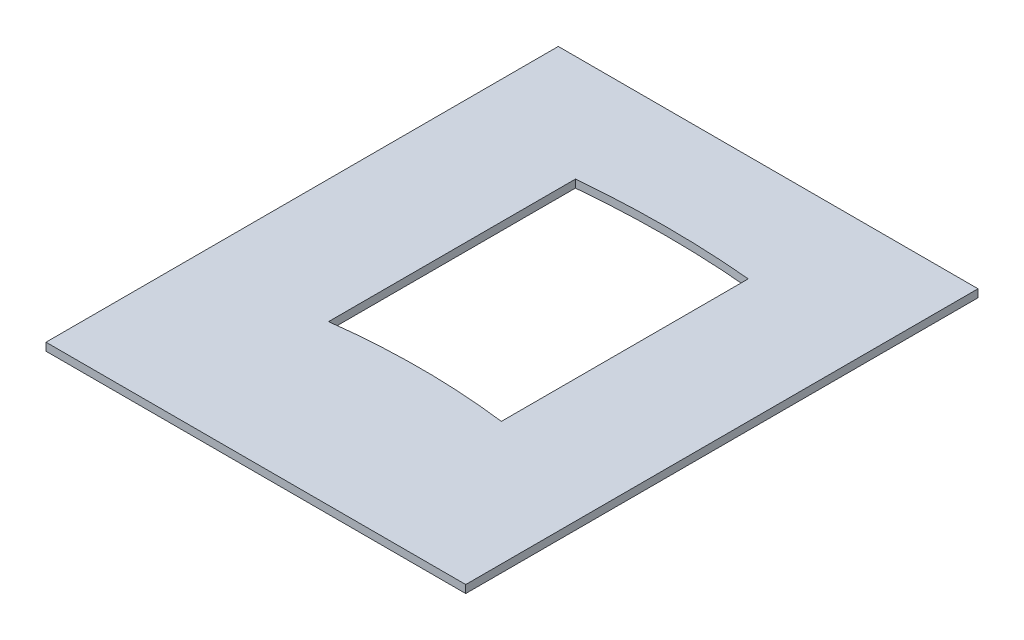
ISO-10303-21;
HEADER;
FILE_DESCRIPTION(('STEP AP214'),'2;1');
FILE_NAME('part.step','',(''),(''),'','','');
FILE_SCHEMA(('AUTOMOTIVE_DESIGN { 1 0 10303 214 1 1 1 1 }'));
ENDSEC;
DATA;
#1=APPLICATION_CONTEXT('core data for automotive mechanical design processes');
#2=APPLICATION_PROTOCOL_DEFINITION('international standard','automotive_design',2000,#1);
#3=PRODUCT_CONTEXT('',#1,'mechanical');
#4=PRODUCT('Part','Part','',(#3));
#5=PRODUCT_RELATED_PRODUCT_CATEGORY('part','',(#4));
#6=PRODUCT_DEFINITION_FORMATION('','',#4);
#7=PRODUCT_DEFINITION_CONTEXT('part definition',#1,'design');
#8=PRODUCT_DEFINITION('design','',#6,#7);
#9=PRODUCT_DEFINITION_SHAPE('','',#8);
#10=(LENGTH_UNIT() NAMED_UNIT(*) SI_UNIT(.MILLI.,.METRE.));
#11=(NAMED_UNIT(*) PLANE_ANGLE_UNIT() SI_UNIT($,.RADIAN.));
#12=(NAMED_UNIT(*) SI_UNIT($,.STERADIAN.) SOLID_ANGLE_UNIT());
#13=UNCERTAINTY_MEASURE_WITH_UNIT(LENGTH_MEASURE(1.E-05),#10,'distance_accuracy_value','');
#14=(GEOMETRIC_REPRESENTATION_CONTEXT(3) GLOBAL_UNCERTAINTY_ASSIGNED_CONTEXT((#13)) GLOBAL_UNIT_ASSIGNED_CONTEXT((#10,
#11,#12)) REPRESENTATION_CONTEXT('',''));
#15=CARTESIAN_POINT('',(0.,0.,0.));
#16=DIRECTION('',(0.,0.,1.));
#17=DIRECTION('',(1.,0.,0.));
#18=AXIS2_PLACEMENT_3D('',#15,#16,#17);
#19=CARTESIAN_POINT('',(0.,0.127,0.));
#20=DIRECTION('',(0.,-1.,0.));
#21=DIRECTION('',(0.,0.,-1.));
#22=AXIS2_PLACEMENT_3D('',#19,#20,#21);
#23=PLANE('',#22);
#24=DIRECTION('',(-1.,0.,0.));
#25=VECTOR('',#24,1.);
#26=CARTESIAN_POINT('',(-3.4,0.127,-5.72200648885004));
#27=LINE('',#26,#25);
#28=CARTESIAN_POINT('',(3.4,0.127,-5.72200648885004));
#29=VERTEX_POINT('',#28);
#30=CARTESIAN_POINT('',(-3.4,0.127,-5.72200648885004));
#31=VERTEX_POINT('',#30);
#32=EDGE_CURVE('E134',#29,#31,#27,.T.);
#33=ORIENTED_EDGE('',*,*,#32,.T.);
#34=DIRECTION('',(0.,0.,1.));
#35=VECTOR('',#34,1.);
#36=CARTESIAN_POINT('',(-3.4,0.127,-5.72200648885004));
#37=LINE('',#36,#35);
#38=CARTESIAN_POINT('',(-3.4,0.127,2.57747869518882));
#39=VERTEX_POINT('',#38);
#40=EDGE_CURVE('E137',#31,#39,#37,.T.);
#41=ORIENTED_EDGE('',*,*,#40,.T.);
#42=DIRECTION('',(1.,0.,0.));
#43=VECTOR('',#42,1.);
#44=CARTESIAN_POINT('',(-3.4,0.127,2.57747869518882));
#45=LINE('',#44,#43);
#46=CARTESIAN_POINT('',(3.4,0.127,2.57747869518882));
#47=VERTEX_POINT('',#46);
#48=EDGE_CURVE('E140',#39,#47,#45,.T.);
#49=ORIENTED_EDGE('',*,*,#48,.T.);
#50=DIRECTION('',(0.,0.,-1.));
#51=VECTOR('',#50,1.);
#52=CARTESIAN_POINT('',(3.4,0.127,-5.72200648885004));
#53=LINE('',#52,#51);
#54=EDGE_CURVE('E142',#47,#29,#53,.T.);
#55=ORIENTED_EDGE('',*,*,#54,.T.);
#56=EDGE_LOOP('',(#33,#41,#49,#55));
#57=FACE_BOUND('',#56,.T.);
#58=CARTESIAN_POINT('',(0.,0.127,10.9345237620756));
#59=DIRECTION('',(0.,1.,0.));
#60=DIRECTION('',(0.,0.,-1.));
#61=AXIS2_PLACEMENT_3D('',#58,#59,#60);
#62=CIRCLE('',#61,15.);
#63=CARTESIAN_POINT('',(1.4,0.127,-4.));
#64=VERTEX_POINT('',#63);
#65=CARTESIAN_POINT('',(-1.4,0.127,-4.));
#66=VERTEX_POINT('',#65);
#67=EDGE_CURVE('E98',#64,#66,#62,.T.);
#68=ORIENTED_EDGE('',*,*,#67,.F.);
#69=DIRECTION('',(0.,0.,-1.));
#70=VECTOR('',#69,1.);
#71=CARTESIAN_POINT('',(1.4,0.127,-4.));
#72=LINE('',#71,#70);
#73=CARTESIAN_POINT('',(1.4,0.127,0.));
#74=VERTEX_POINT('',#73);
#75=EDGE_CURVE('E120',#74,#64,#72,.T.);
#76=ORIENTED_EDGE('',*,*,#75,.F.);
#77=CARTESIAN_POINT('',(0.,0.127,10.9105453575887));
#78=DIRECTION('',(0.,-1.,0.));
#79=DIRECTION('',(0.,0.,-1.));
#80=AXIS2_PLACEMENT_3D('',#77,#78,#79);
#81=CIRCLE('',#80,11.);
#82=CARTESIAN_POINT('',(-1.40000000000001,0.127,0.));
#83=VERTEX_POINT('',#82);
#84=EDGE_CURVE('E118',#83,#74,#81,.T.);
#85=ORIENTED_EDGE('',*,*,#84,.F.);
#86=DIRECTION('',(0.,0.,1.));
#87=VECTOR('',#86,1.);
#88=CARTESIAN_POINT('',(-1.4,0.127,-4.));
#89=LINE('',#88,#87);
#90=EDGE_CURVE('E106',#66,#83,#89,.T.);
#91=ORIENTED_EDGE('',*,*,#90,.F.);
#92=EDGE_LOOP('',(#68,#76,#85,#91));
#93=FACE_BOUND('',#92,.T.);
#94=ADVANCED_FACE('F33',(#57,#93),#23,.F.);
#95=CARTESIAN_POINT('',(0.,0.,0.));
#96=DIRECTION('',(0.,-1.,0.));
#97=DIRECTION('',(0.,0.,-1.));
#98=AXIS2_PLACEMENT_3D('',#95,#96,#97);
#99=PLANE('',#98);
#100=DIRECTION('',(-1.,0.,0.));
#101=VECTOR('',#100,1.);
#102=CARTESIAN_POINT('',(-3.4,0.,-5.72200648885004));
#103=LINE('',#102,#101);
#104=CARTESIAN_POINT('',(3.4,0.,-5.72200648885004));
#105=VERTEX_POINT('',#104);
#106=CARTESIAN_POINT('',(-3.4,0.,-5.72200648885004));
#107=VERTEX_POINT('',#106);
#108=EDGE_CURVE('E114',#105,#107,#103,.T.);
#109=ORIENTED_EDGE('',*,*,#108,.F.);
#110=DIRECTION('',(0.,0.,-1.));
#111=VECTOR('',#110,1.);
#112=CARTESIAN_POINT('',(3.4,0.,-5.72200648885004));
#113=LINE('',#112,#111);
#114=CARTESIAN_POINT('',(3.4,0.,2.57747869518882));
#115=VERTEX_POINT('',#114);
#116=EDGE_CURVE('E138',#115,#105,#113,.T.);
#117=ORIENTED_EDGE('',*,*,#116,.F.);
#118=DIRECTION('',(1.,0.,0.));
#119=VECTOR('',#118,1.);
#120=CARTESIAN_POINT('',(-3.4,0.,2.57747869518882));
#121=LINE('',#120,#119);
#122=CARTESIAN_POINT('',(-3.4,0.,2.57747869518882));
#123=VERTEX_POINT('',#122);
#124=EDGE_CURVE('E149',#123,#115,#121,.T.);
#125=ORIENTED_EDGE('',*,*,#124,.F.);
#126=DIRECTION('',(0.,0.,1.));
#127=VECTOR('',#126,1.);
#128=CARTESIAN_POINT('',(-3.4,0.,-5.72200648885004));
#129=LINE('',#128,#127);
#130=EDGE_CURVE('E147',#107,#123,#129,.T.);
#131=ORIENTED_EDGE('',*,*,#130,.F.);
#132=EDGE_LOOP('',(#109,#117,#125,#131));
#133=FACE_BOUND('',#132,.T.);
#134=DIRECTION('',(0.,0.,-1.));
#135=VECTOR('',#134,1.);
#136=CARTESIAN_POINT('',(1.4,0.,-4.));
#137=LINE('',#136,#135);
#138=CARTESIAN_POINT('',(1.4,0.,0.));
#139=VERTEX_POINT('',#138);
#140=CARTESIAN_POINT('',(1.4,0.,-4.));
#141=VERTEX_POINT('',#140);
#142=EDGE_CURVE('E107',#139,#141,#137,.T.);
#143=ORIENTED_EDGE('',*,*,#142,.T.);
#144=CARTESIAN_POINT('',(0.,0.,10.9345237620756));
#145=DIRECTION('',(0.,1.,0.));
#146=DIRECTION('',(0.,0.,-1.));
#147=AXIS2_PLACEMENT_3D('',#144,#145,#146);
#148=CIRCLE('',#147,15.);
#149=CARTESIAN_POINT('',(-1.4,0.,-4.));
#150=VERTEX_POINT('',#149);
#151=EDGE_CURVE('E56',#141,#150,#148,.T.);
#152=ORIENTED_EDGE('',*,*,#151,.T.);
#153=DIRECTION('',(0.,0.,1.));
#154=VECTOR('',#153,1.);
#155=CARTESIAN_POINT('',(-1.4,0.,-4.));
#156=LINE('',#155,#154);
#157=CARTESIAN_POINT('',(-1.40000000000001,0.,0.));
#158=VERTEX_POINT('',#157);
#159=EDGE_CURVE('E113',#150,#158,#156,.T.);
#160=ORIENTED_EDGE('',*,*,#159,.T.);
#161=CARTESIAN_POINT('',(0.,0.,10.9105453575887));
#162=DIRECTION('',(0.,-1.,0.));
#163=DIRECTION('',(0.,0.,-1.));
#164=AXIS2_PLACEMENT_3D('',#161,#162,#163);
#165=CIRCLE('',#164,11.);
#166=EDGE_CURVE('E126',#158,#139,#165,.T.);
#167=ORIENTED_EDGE('',*,*,#166,.T.);
#168=EDGE_LOOP('',(#143,#152,#160,#167));
#169=FACE_BOUND('',#168,.T.);
#170=ADVANCED_FACE('F167',(#133,#169),#99,.T.);
#171=CARTESIAN_POINT('',(-3.4,0.127,-5.72200648885004));
#172=DIRECTION('',(0.,0.,1.));
#173=DIRECTION('',(1.,0.,0.));
#174=AXIS2_PLACEMENT_3D('',#171,#172,#173);
#175=PLANE('',#174);
#176=ORIENTED_EDGE('',*,*,#108,.T.);
#177=DIRECTION('',(0.,-1.,0.));
#178=VECTOR('',#177,1.);
#179=CARTESIAN_POINT('',(-3.4,0.127,-5.72200648885004));
#180=LINE('',#179,#178);
#181=EDGE_CURVE('E11',#31,#107,#180,.T.);
#182=ORIENTED_EDGE('',*,*,#181,.F.);
#183=ORIENTED_EDGE('',*,*,#32,.F.);
#184=DIRECTION('',(0.,-1.,0.));
#185=VECTOR('',#184,1.);
#186=CARTESIAN_POINT('',(3.4,0.127,-5.72200648885004));
#187=LINE('',#186,#185);
#188=EDGE_CURVE('E144',#29,#105,#187,.T.);
#189=ORIENTED_EDGE('',*,*,#188,.T.);
#190=EDGE_LOOP('',(#176,#182,#183,#189));
#191=FACE_BOUND('',#190,.T.);
#192=ADVANCED_FACE('F35',(#191),#175,.F.);
#193=CARTESIAN_POINT('',(-3.4,0.127,-5.72200648885004));
#194=DIRECTION('',(1.,0.,0.));
#195=DIRECTION('',(0.,0.,-1.));
#196=AXIS2_PLACEMENT_3D('',#193,#194,#195);
#197=PLANE('',#196);
#198=ORIENTED_EDGE('',*,*,#130,.T.);
#199=DIRECTION('',(0.,-1.,0.));
#200=VECTOR('',#199,1.);
#201=CARTESIAN_POINT('',(-3.4,0.127,2.57747869518882));
#202=LINE('',#201,#200);
#203=EDGE_CURVE('E41',#39,#123,#202,.T.);
#204=ORIENTED_EDGE('',*,*,#203,.F.);
#205=ORIENTED_EDGE('',*,*,#40,.F.);
#206=ORIENTED_EDGE('',*,*,#181,.T.);
#207=EDGE_LOOP('',(#198,#204,#205,#206));
#208=FACE_BOUND('',#207,.T.);
#209=ADVANCED_FACE('F177',(#208),#197,.F.);
#210=CARTESIAN_POINT('',(-3.4,0.127,2.57747869518882));
#211=DIRECTION('',(0.,0.,-1.));
#212=DIRECTION('',(-1.,0.,0.));
#213=AXIS2_PLACEMENT_3D('',#210,#211,#212);
#214=PLANE('',#213);
#215=ORIENTED_EDGE('',*,*,#124,.T.);
#216=DIRECTION('',(0.,-1.,0.));
#217=VECTOR('',#216,1.);
#218=CARTESIAN_POINT('',(3.4,0.127,2.57747869518882));
#219=LINE('',#218,#217);
#220=EDGE_CURVE('E154',#47,#115,#219,.T.);
#221=ORIENTED_EDGE('',*,*,#220,.F.);
#222=ORIENTED_EDGE('',*,*,#48,.F.);
#223=ORIENTED_EDGE('',*,*,#203,.T.);
#224=EDGE_LOOP('',(#215,#221,#222,#223));
#225=FACE_BOUND('',#224,.T.);
#226=ADVANCED_FACE('F161',(#225),#214,.F.);
#227=CARTESIAN_POINT('',(3.4,0.127,-5.72200648885004));
#228=DIRECTION('',(-1.,0.,0.));
#229=DIRECTION('',(0.,0.,1.));
#230=AXIS2_PLACEMENT_3D('',#227,#228,#229);
#231=PLANE('',#230);
#232=ORIENTED_EDGE('',*,*,#116,.T.);
#233=ORIENTED_EDGE('',*,*,#188,.F.);
#234=ORIENTED_EDGE('',*,*,#54,.F.);
#235=ORIENTED_EDGE('',*,*,#220,.T.);
#236=EDGE_LOOP('',(#232,#233,#234,#235));
#237=FACE_BOUND('',#236,.T.);
#238=ADVANCED_FACE('F171',(#237),#231,.F.);
#239=CARTESIAN_POINT('',(0.,0.127,10.9345237620756));
#240=DIRECTION('',(0.,-1.,0.));
#241=DIRECTION('',(0.,0.,-1.));
#242=AXIS2_PLACEMENT_3D('',#239,#240,#241);
#243=CYLINDRICAL_SURFACE('',#242,15.);
#244=ORIENTED_EDGE('',*,*,#151,.F.);
#245=DIRECTION('',(0.,-1.,0.));
#246=VECTOR('',#245,1.);
#247=CARTESIAN_POINT('',(1.4,0.127,-4.));
#248=LINE('',#247,#246);
#249=EDGE_CURVE('E102',#64,#141,#248,.T.);
#250=ORIENTED_EDGE('',*,*,#249,.F.);
#251=ORIENTED_EDGE('',*,*,#67,.T.);
#252=DIRECTION('',(0.,-1.,0.));
#253=VECTOR('',#252,1.);
#254=CARTESIAN_POINT('',(-1.4,0.127,-4.));
#255=LINE('',#254,#253);
#256=EDGE_CURVE('E101',#66,#150,#255,.T.);
#257=ORIENTED_EDGE('',*,*,#256,.T.);
#258=EDGE_LOOP('',(#244,#250,#251,#257));
#259=FACE_BOUND('',#258,.T.);
#260=ADVANCED_FACE('F100',(#259),#243,.F.);
#261=CARTESIAN_POINT('',(-1.4,0.127,-4.));
#262=DIRECTION('',(1.,0.,0.));
#263=DIRECTION('',(0.,0.,-1.));
#264=AXIS2_PLACEMENT_3D('',#261,#262,#263);
#265=PLANE('',#264);
#266=ORIENTED_EDGE('',*,*,#159,.F.);
#267=ORIENTED_EDGE('',*,*,#256,.F.);
#268=ORIENTED_EDGE('',*,*,#90,.T.);
#269=DIRECTION('',(0.,-1.,0.));
#270=VECTOR('',#269,1.);
#271=CARTESIAN_POINT('',(-1.40000000000001,0.127,0.));
#272=LINE('',#271,#270);
#273=EDGE_CURVE('E115',#83,#158,#272,.T.);
#274=ORIENTED_EDGE('',*,*,#273,.T.);
#275=EDGE_LOOP('',(#266,#267,#268,#274));
#276=FACE_BOUND('',#275,.T.);
#277=ADVANCED_FACE('F110',(#276),#265,.T.);
#278=CARTESIAN_POINT('',(0.,0.127,10.9105453575887));
#279=DIRECTION('',(0.,-1.,0.));
#280=DIRECTION('',(0.,0.,-1.));
#281=AXIS2_PLACEMENT_3D('',#278,#279,#280);
#282=CYLINDRICAL_SURFACE('',#281,11.);
#283=ORIENTED_EDGE('',*,*,#166,.F.);
#284=ORIENTED_EDGE('',*,*,#273,.F.);
#285=ORIENTED_EDGE('',*,*,#84,.T.);
#286=DIRECTION('',(0.,-1.,0.));
#287=VECTOR('',#286,1.);
#288=CARTESIAN_POINT('',(1.4,0.127,0.));
#289=LINE('',#288,#287);
#290=EDGE_CURVE('E48',#74,#139,#289,.T.);
#291=ORIENTED_EDGE('',*,*,#290,.T.);
#292=EDGE_LOOP('',(#283,#284,#285,#291));
#293=FACE_BOUND('',#292,.T.);
#294=ADVANCED_FACE('F200',(#293),#282,.T.);
#295=CARTESIAN_POINT('',(1.4,0.127,-4.));
#296=DIRECTION('',(-1.,0.,0.));
#297=DIRECTION('',(0.,0.,1.));
#298=AXIS2_PLACEMENT_3D('',#295,#296,#297);
#299=PLANE('',#298);
#300=ORIENTED_EDGE('',*,*,#142,.F.);
#301=ORIENTED_EDGE('',*,*,#290,.F.);
#302=ORIENTED_EDGE('',*,*,#75,.T.);
#303=ORIENTED_EDGE('',*,*,#249,.T.);
#304=EDGE_LOOP('',(#300,#301,#302,#303));
#305=FACE_BOUND('',#304,.T.);
#306=ADVANCED_FACE('F204',(#305),#299,.T.);
#307=CLOSED_SHELL('',(#94,#170,#192,#209,#226,#238,#260,#277,#294,#306));
#308=MANIFOLD_SOLID_BREP('B2',#307);
#309=ADVANCED_BREP_SHAPE_REPRESENTATION('',(#18,#308),#14);
#310=SHAPE_DEFINITION_REPRESENTATION(#9,#309);
ENDSEC;
END-ISO-10303-21;
